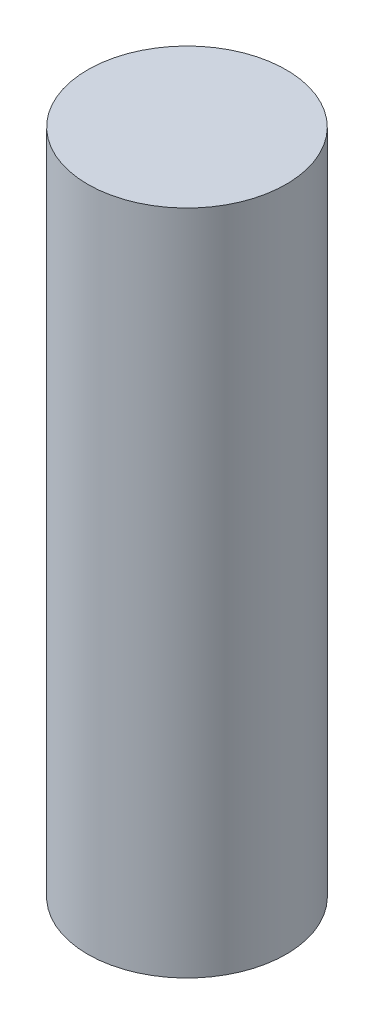
ISO-10303-21;
HEADER;
FILE_DESCRIPTION(('STEP AP214'),'2;1');
FILE_NAME('part.step','',(''),(''),'','','');
FILE_SCHEMA(('AUTOMOTIVE_DESIGN { 1 0 10303 214 1 1 1 1 }'));
ENDSEC;
DATA;
#1=APPLICATION_CONTEXT('core data for automotive mechanical design processes');
#2=APPLICATION_PROTOCOL_DEFINITION('international standard','automotive_design',2000,#1);
#3=PRODUCT_CONTEXT('',#1,'mechanical');
#4=PRODUCT('Part','Part','',(#3));
#5=PRODUCT_RELATED_PRODUCT_CATEGORY('part','',(#4));
#6=PRODUCT_DEFINITION_FORMATION('','',#4);
#7=PRODUCT_DEFINITION_CONTEXT('part definition',#1,'design');
#8=PRODUCT_DEFINITION('design','',#6,#7);
#9=PRODUCT_DEFINITION_SHAPE('','',#8);
#10=(LENGTH_UNIT() NAMED_UNIT(*) SI_UNIT(.MILLI.,.METRE.));
#11=(NAMED_UNIT(*) PLANE_ANGLE_UNIT() SI_UNIT($,.RADIAN.));
#12=(NAMED_UNIT(*) SI_UNIT($,.STERADIAN.) SOLID_ANGLE_UNIT());
#13=UNCERTAINTY_MEASURE_WITH_UNIT(LENGTH_MEASURE(1.E-05),#10,'distance_accuracy_value','');
#14=(GEOMETRIC_REPRESENTATION_CONTEXT(3) GLOBAL_UNCERTAINTY_ASSIGNED_CONTEXT((#13)) GLOBAL_UNIT_ASSIGNED_CONTEXT((#10,
#11,#12)) REPRESENTATION_CONTEXT('',''));
#15=CARTESIAN_POINT('',(0.,0.,0.));
#16=DIRECTION('',(0.,0.,1.));
#17=DIRECTION('',(1.,0.,0.));
#18=AXIS2_PLACEMENT_3D('',#15,#16,#17);
#19=CARTESIAN_POINT('',(0.,24.,0.));
#20=DIRECTION('',(0.,-1.,0.));
#21=DIRECTION('',(0.,0.,-1.));
#22=AXIS2_PLACEMENT_3D('',#19,#20,#21);
#23=CYLINDRICAL_SURFACE('',#22,3.571875);
#24=CARTESIAN_POINT('',(0.,24.,0.));
#25=DIRECTION('',(0.,1.,0.));
#26=DIRECTION('',(0.,0.,1.));
#27=AXIS2_PLACEMENT_3D('',#24,#25,#26);
#28=CIRCLE('',#27,3.571875);
#29=CARTESIAN_POINT('',(0.,24.,3.571875));
#30=VERTEX_POINT('',#29);
#31=EDGE_CURVE('E10',#30,#30,#28,.T.);
#32=ORIENTED_EDGE('',*,*,#31,.F.);
#33=EDGE_LOOP('',(#32));
#34=FACE_BOUND('',#33,.T.);
#35=CARTESIAN_POINT('',(0.,0.,0.));
#36=DIRECTION('',(0.,1.,0.));
#37=DIRECTION('',(0.,0.,1.));
#38=AXIS2_PLACEMENT_3D('',#35,#36,#37);
#39=CIRCLE('',#38,3.571875);
#40=CARTESIAN_POINT('',(0.,0.,3.571875));
#41=VERTEX_POINT('',#40);
#42=EDGE_CURVE('E34',#41,#41,#39,.T.);
#43=ORIENTED_EDGE('',*,*,#42,.T.);
#44=EDGE_LOOP('',(#43));
#45=FACE_BOUND('',#44,.T.);
#46=ADVANCED_FACE('F31',(#34,#45),#23,.T.);
#47=CARTESIAN_POINT('',(0.,24.,0.));
#48=DIRECTION('',(0.,1.,0.));
#49=DIRECTION('',(0.,0.,1.));
#50=AXIS2_PLACEMENT_3D('',#47,#48,#49);
#51=PLANE('',#50);
#52=ORIENTED_EDGE('',*,*,#31,.T.);
#53=EDGE_LOOP('',(#52));
#54=FACE_BOUND('',#53,.T.);
#55=ADVANCED_FACE('F46',(#54),#51,.T.);
#56=CARTESIAN_POINT('',(0.,0.,0.));
#57=DIRECTION('',(0.,1.,0.));
#58=DIRECTION('',(0.,0.,1.));
#59=AXIS2_PLACEMENT_3D('',#56,#57,#58);
#60=PLANE('',#59);
#61=ORIENTED_EDGE('',*,*,#42,.F.);
#62=EDGE_LOOP('',(#61));
#63=FACE_BOUND('',#62,.T.);
#64=ADVANCED_FACE('F44',(#63),#60,.F.);
#65=CLOSED_SHELL('',(#46,#55,#64));
#66=MANIFOLD_SOLID_BREP('B2',#65);
#67=ADVANCED_BREP_SHAPE_REPRESENTATION('',(#18,#66),#14);
#68=SHAPE_DEFINITION_REPRESENTATION(#9,#67);
ENDSEC;
END-ISO-10303-21;
